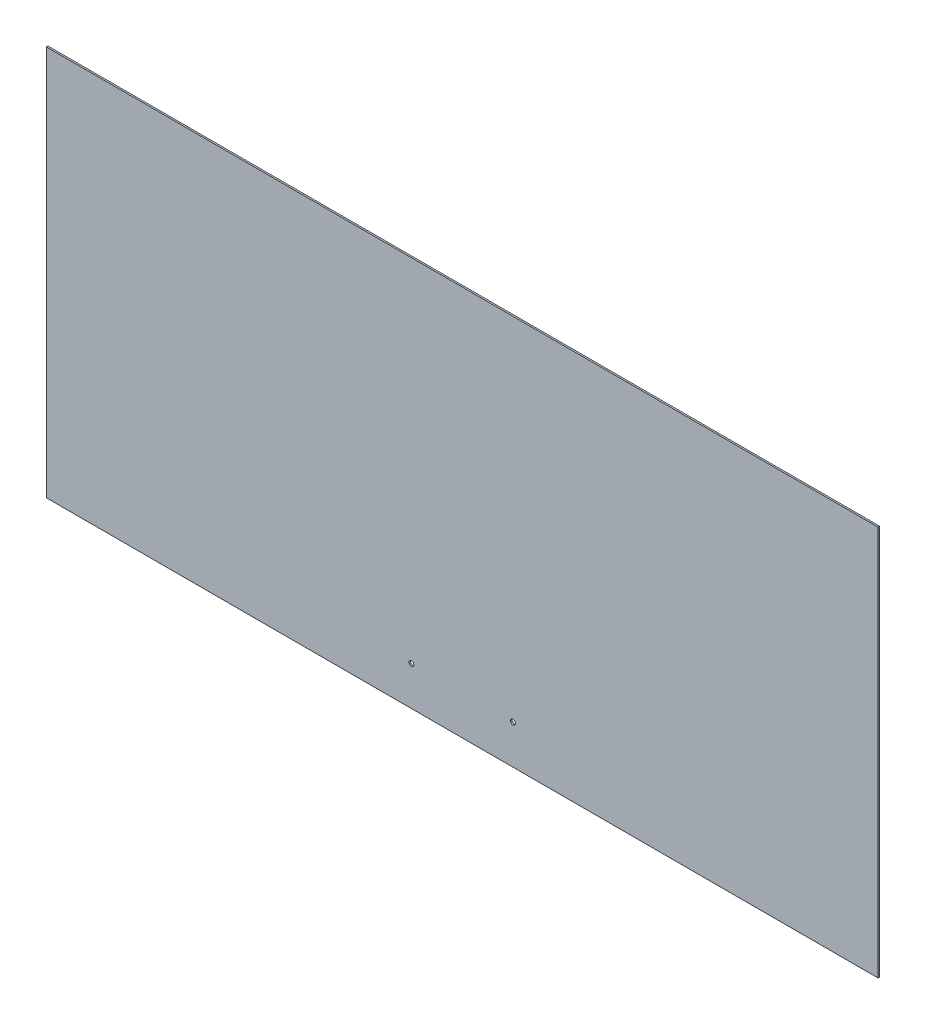
ISO-10303-21;
HEADER;
FILE_DESCRIPTION(('STEP AP214'),'2;1');
FILE_NAME('part.step','',(''),(''),'','','');
FILE_SCHEMA(('AUTOMOTIVE_DESIGN { 1 0 10303 214 1 1 1 1 }'));
ENDSEC;
DATA;
#1=APPLICATION_CONTEXT('core data for automotive mechanical design processes');
#2=APPLICATION_PROTOCOL_DEFINITION('international standard','automotive_design',2000,#1);
#3=PRODUCT_CONTEXT('',#1,'mechanical');
#4=PRODUCT('Part','Part','',(#3));
#5=PRODUCT_RELATED_PRODUCT_CATEGORY('part','',(#4));
#6=PRODUCT_DEFINITION_FORMATION('','',#4);
#7=PRODUCT_DEFINITION_CONTEXT('part definition',#1,'design');
#8=PRODUCT_DEFINITION('design','',#6,#7);
#9=PRODUCT_DEFINITION_SHAPE('','',#8);
#10=(LENGTH_UNIT() NAMED_UNIT(*) SI_UNIT(.MILLI.,.METRE.));
#11=(NAMED_UNIT(*) PLANE_ANGLE_UNIT() SI_UNIT($,.RADIAN.));
#12=(NAMED_UNIT(*) SI_UNIT($,.STERADIAN.) SOLID_ANGLE_UNIT());
#13=UNCERTAINTY_MEASURE_WITH_UNIT(LENGTH_MEASURE(1.E-05),#10,'distance_accuracy_value','');
#14=(GEOMETRIC_REPRESENTATION_CONTEXT(3) GLOBAL_UNCERTAINTY_ASSIGNED_CONTEXT((#13)) GLOBAL_UNIT_ASSIGNED_CONTEXT((#10,
#11,#12)) REPRESENTATION_CONTEXT('',''));
#15=CARTESIAN_POINT('',(0.,0.,0.));
#16=DIRECTION('',(0.,0.,1.));
#17=DIRECTION('',(1.,0.,0.));
#18=AXIS2_PLACEMENT_3D('',#15,#16,#17);
#19=CARTESIAN_POINT('',(0.,0.,2.));
#20=DIRECTION('',(1.,0.,0.));
#21=DIRECTION('',(0.,1.,0.));
#22=AXIS2_PLACEMENT_3D('',#19,#20,#21);
#23=PLANE('',#22);
#24=DIRECTION('',(0.,-1.,0.));
#25=VECTOR('',#24,1.);
#26=CARTESIAN_POINT('',(0.,0.,0.));
#27=LINE('',#26,#25);
#28=CARTESIAN_POINT('',(0.,0.,0.));
#29=VERTEX_POINT('',#28);
#30=CARTESIAN_POINT('',(0.,-500.,0.));
#31=VERTEX_POINT('',#30);
#32=EDGE_CURVE('E101',#29,#31,#27,.T.);
#33=ORIENTED_EDGE('',*,*,#32,.T.);
#34=DIRECTION('',(0.,0.,-1.));
#35=VECTOR('',#34,1.);
#36=CARTESIAN_POINT('',(0.,-500.,2.));
#37=LINE('',#36,#35);
#38=CARTESIAN_POINT('',(0.,-500.,2.));
#39=VERTEX_POINT('',#38);
#40=EDGE_CURVE('E11',#39,#31,#37,.T.);
#41=ORIENTED_EDGE('',*,*,#40,.F.);
#42=DIRECTION('',(0.,-1.,0.));
#43=VECTOR('',#42,1.);
#44=CARTESIAN_POINT('',(0.,0.,2.));
#45=LINE('',#44,#43);
#46=CARTESIAN_POINT('',(0.,0.,2.));
#47=VERTEX_POINT('',#46);
#48=EDGE_CURVE('E89',#47,#39,#45,.T.);
#49=ORIENTED_EDGE('',*,*,#48,.F.);
#50=DIRECTION('',(0.,0.,-1.));
#51=VECTOR('',#50,1.);
#52=CARTESIAN_POINT('',(0.,0.,2.));
#53=LINE('',#52,#51);
#54=EDGE_CURVE('E97',#47,#29,#53,.T.);
#55=ORIENTED_EDGE('',*,*,#54,.T.);
#56=EDGE_LOOP('',(#33,#41,#49,#55));
#57=FACE_BOUND('',#56,.T.);
#58=ADVANCED_FACE('F38',(#57),#23,.F.);
#59=CARTESIAN_POINT('',(0.,-500.,2.));
#60=DIRECTION('',(0.,1.,0.));
#61=DIRECTION('',(0.,0.,1.));
#62=AXIS2_PLACEMENT_3D('',#59,#60,#61);
#63=PLANE('',#62);
#64=DIRECTION('',(1.,0.,0.));
#65=VECTOR('',#64,1.);
#66=CARTESIAN_POINT('',(0.,-500.,0.));
#67=LINE('',#66,#65);
#68=CARTESIAN_POINT('',(1065.,-500.,0.));
#69=VERTEX_POINT('',#68);
#70=EDGE_CURVE('E93',#31,#69,#67,.T.);
#71=ORIENTED_EDGE('',*,*,#70,.T.);
#72=DIRECTION('',(0.,0.,-1.));
#73=VECTOR('',#72,1.);
#74=CARTESIAN_POINT('',(1065.,-500.,2.));
#75=LINE('',#74,#73);
#76=CARTESIAN_POINT('',(1065.,-500.,2.));
#77=VERTEX_POINT('',#76);
#78=EDGE_CURVE('E46',#77,#69,#75,.T.);
#79=ORIENTED_EDGE('',*,*,#78,.F.);
#80=DIRECTION('',(1.,0.,0.));
#81=VECTOR('',#80,1.);
#82=CARTESIAN_POINT('',(0.,-500.,2.));
#83=LINE('',#82,#81);
#84=EDGE_CURVE('E84',#39,#77,#83,.T.);
#85=ORIENTED_EDGE('',*,*,#84,.F.);
#86=ORIENTED_EDGE('',*,*,#40,.T.);
#87=EDGE_LOOP('',(#71,#79,#85,#86));
#88=FACE_BOUND('',#87,.T.);
#89=ADVANCED_FACE('F92',(#88),#63,.F.);
#90=CARTESIAN_POINT('',(1065.,0.,2.));
#91=DIRECTION('',(-1.,0.,0.));
#92=DIRECTION('',(0.,0.,1.));
#93=AXIS2_PLACEMENT_3D('',#90,#91,#92);
#94=PLANE('',#93);
#95=DIRECTION('',(0.,1.,0.));
#96=VECTOR('',#95,1.);
#97=CARTESIAN_POINT('',(1065.,0.,0.));
#98=LINE('',#97,#96);
#99=CARTESIAN_POINT('',(1065.,0.,0.));
#100=VERTEX_POINT('',#99);
#101=EDGE_CURVE('E71',#69,#100,#98,.T.);
#102=ORIENTED_EDGE('',*,*,#101,.T.);
#103=DIRECTION('',(0.,0.,-1.));
#104=VECTOR('',#103,1.);
#105=CARTESIAN_POINT('',(1065.,0.,2.));
#106=LINE('',#105,#104);
#107=CARTESIAN_POINT('',(1065.,0.,2.));
#108=VERTEX_POINT('',#107);
#109=EDGE_CURVE('E94',#108,#100,#106,.T.);
#110=ORIENTED_EDGE('',*,*,#109,.F.);
#111=DIRECTION('',(0.,1.,0.));
#112=VECTOR('',#111,1.);
#113=CARTESIAN_POINT('',(1065.,0.,2.));
#114=LINE('',#113,#112);
#115=EDGE_CURVE('E87',#77,#108,#114,.T.);
#116=ORIENTED_EDGE('',*,*,#115,.F.);
#117=ORIENTED_EDGE('',*,*,#78,.T.);
#118=EDGE_LOOP('',(#102,#110,#116,#117));
#119=FACE_BOUND('',#118,.T.);
#120=ADVANCED_FACE('F95',(#119),#94,.F.);
#121=CARTESIAN_POINT('',(0.,0.,2.));
#122=DIRECTION('',(0.,-1.,0.));
#123=DIRECTION('',(0.,0.,-1.));
#124=AXIS2_PLACEMENT_3D('',#121,#122,#123);
#125=PLANE('',#124);
#126=DIRECTION('',(-1.,0.,0.));
#127=VECTOR('',#126,1.);
#128=CARTESIAN_POINT('',(0.,0.,0.));
#129=LINE('',#128,#127);
#130=EDGE_CURVE('E77',#100,#29,#129,.T.);
#131=ORIENTED_EDGE('',*,*,#130,.T.);
#132=ORIENTED_EDGE('',*,*,#54,.F.);
#133=DIRECTION('',(-1.,0.,0.));
#134=VECTOR('',#133,1.);
#135=CARTESIAN_POINT('',(0.,0.,2.));
#136=LINE('',#135,#134);
#137=EDGE_CURVE('E54',#108,#47,#136,.T.);
#138=ORIENTED_EDGE('',*,*,#137,.F.);
#139=ORIENTED_EDGE('',*,*,#109,.T.);
#140=EDGE_LOOP('',(#131,#132,#138,#139));
#141=FACE_BOUND('',#140,.T.);
#142=ADVANCED_FACE('F109',(#141),#125,.F.);
#143=CARTESIAN_POINT('',(0.,0.,2.));
#144=DIRECTION('',(0.,0.,1.));
#145=DIRECTION('',(1.,0.,0.));
#146=AXIS2_PLACEMENT_3D('',#143,#144,#145);
#147=PLANE('',#146);
#148=CARTESIAN_POINT('',(597.5,-450.,2.));
#149=DIRECTION('',(0.,0.,1.));
#150=DIRECTION('',(1.,0.,0.));
#151=AXIS2_PLACEMENT_3D('',#148,#149,#150);
#152=CIRCLE('',#151,3.09999999999999);
#153=CARTESIAN_POINT('',(600.6,-450.,2.));
#154=VERTEX_POINT('',#153);
#155=EDGE_CURVE('E121',#154,#154,#152,.T.);
#156=ORIENTED_EDGE('',*,*,#155,.F.);
#157=EDGE_LOOP('',(#156));
#158=FACE_BOUND('',#157,.T.);
#159=CARTESIAN_POINT('',(467.5,-450.,2.));
#160=DIRECTION('',(0.,0.,1.));
#161=DIRECTION('',(1.,0.,0.));
#162=AXIS2_PLACEMENT_3D('',#159,#160,#161);
#163=CIRCLE('',#162,3.09999999999999);
#164=CARTESIAN_POINT('',(470.6,-450.,2.));
#165=VERTEX_POINT('',#164);
#166=EDGE_CURVE('E118',#165,#165,#163,.T.);
#167=ORIENTED_EDGE('',*,*,#166,.F.);
#168=EDGE_LOOP('',(#167));
#169=FACE_BOUND('',#168,.T.);
#170=ORIENTED_EDGE('',*,*,#48,.T.);
#171=ORIENTED_EDGE('',*,*,#84,.T.);
#172=ORIENTED_EDGE('',*,*,#115,.T.);
#173=ORIENTED_EDGE('',*,*,#137,.T.);
#174=EDGE_LOOP('',(#170,#171,#172,#173));
#175=FACE_BOUND('',#174,.T.);
#176=ADVANCED_FACE('F85',(#158,#169,#175),#147,.T.);
#177=CARTESIAN_POINT('',(0.,0.,0.));
#178=DIRECTION('',(0.,0.,1.));
#179=DIRECTION('',(1.,0.,0.));
#180=AXIS2_PLACEMENT_3D('',#177,#178,#179);
#181=PLANE('',#180);
#182=CARTESIAN_POINT('',(597.5,-450.,0.));
#183=DIRECTION('',(0.,0.,1.));
#184=DIRECTION('',(1.,0.,0.));
#185=AXIS2_PLACEMENT_3D('',#182,#183,#184);
#186=CIRCLE('',#185,3.09999999999999);
#187=CARTESIAN_POINT('',(600.6,-450.,0.));
#188=VERTEX_POINT('',#187);
#189=EDGE_CURVE('E104',#188,#188,#186,.T.);
#190=ORIENTED_EDGE('',*,*,#189,.T.);
#191=EDGE_LOOP('',(#190));
#192=FACE_BOUND('',#191,.T.);
#193=CARTESIAN_POINT('',(467.5,-450.,0.));
#194=DIRECTION('',(0.,0.,1.));
#195=DIRECTION('',(1.,0.,0.));
#196=AXIS2_PLACEMENT_3D('',#193,#194,#195);
#197=CIRCLE('',#196,3.09999999999999);
#198=CARTESIAN_POINT('',(470.6,-450.,0.));
#199=VERTEX_POINT('',#198);
#200=EDGE_CURVE('E115',#199,#199,#197,.T.);
#201=ORIENTED_EDGE('',*,*,#200,.T.);
#202=EDGE_LOOP('',(#201));
#203=FACE_BOUND('',#202,.T.);
#204=ORIENTED_EDGE('',*,*,#32,.F.);
#205=ORIENTED_EDGE('',*,*,#130,.F.);
#206=ORIENTED_EDGE('',*,*,#101,.F.);
#207=ORIENTED_EDGE('',*,*,#70,.F.);
#208=EDGE_LOOP('',(#204,#205,#206,#207));
#209=FACE_BOUND('',#208,.T.);
#210=ADVANCED_FACE('F112',(#192,#203,#209),#181,.F.);
#211=CARTESIAN_POINT('',(467.5,-450.,0.));
#212=DIRECTION('',(0.,0.,1.));
#213=DIRECTION('',(1.,0.,0.));
#214=AXIS2_PLACEMENT_3D('',#211,#212,#213);
#215=CYLINDRICAL_SURFACE('',#214,3.09999999999999);
#216=ORIENTED_EDGE('',*,*,#200,.F.);
#217=EDGE_LOOP('',(#216));
#218=FACE_BOUND('',#217,.T.);
#219=ORIENTED_EDGE('',*,*,#166,.T.);
#220=EDGE_LOOP('',(#219));
#221=FACE_BOUND('',#220,.T.);
#222=ADVANCED_FACE('F132',(#218,#221),#215,.F.);
#223=CARTESIAN_POINT('',(597.5,-450.,0.));
#224=DIRECTION('',(0.,0.,1.));
#225=DIRECTION('',(1.,0.,0.));
#226=AXIS2_PLACEMENT_3D('',#223,#224,#225);
#227=CYLINDRICAL_SURFACE('',#226,3.09999999999999);
#228=ORIENTED_EDGE('',*,*,#189,.F.);
#229=EDGE_LOOP('',(#228));
#230=FACE_BOUND('',#229,.T.);
#231=ORIENTED_EDGE('',*,*,#155,.T.);
#232=EDGE_LOOP('',(#231));
#233=FACE_BOUND('',#232,.T.);
#234=ADVANCED_FACE('F129',(#230,#233),#227,.F.);
#235=CLOSED_SHELL('',(#58,#89,#120,#142,#176,#210,#222,#234));
#236=MANIFOLD_SOLID_BREP('B2',#235);
#237=ADVANCED_BREP_SHAPE_REPRESENTATION('',(#18,#236),#14);
#238=SHAPE_DEFINITION_REPRESENTATION(#9,#237);
ENDSEC;
END-ISO-10303-21;
